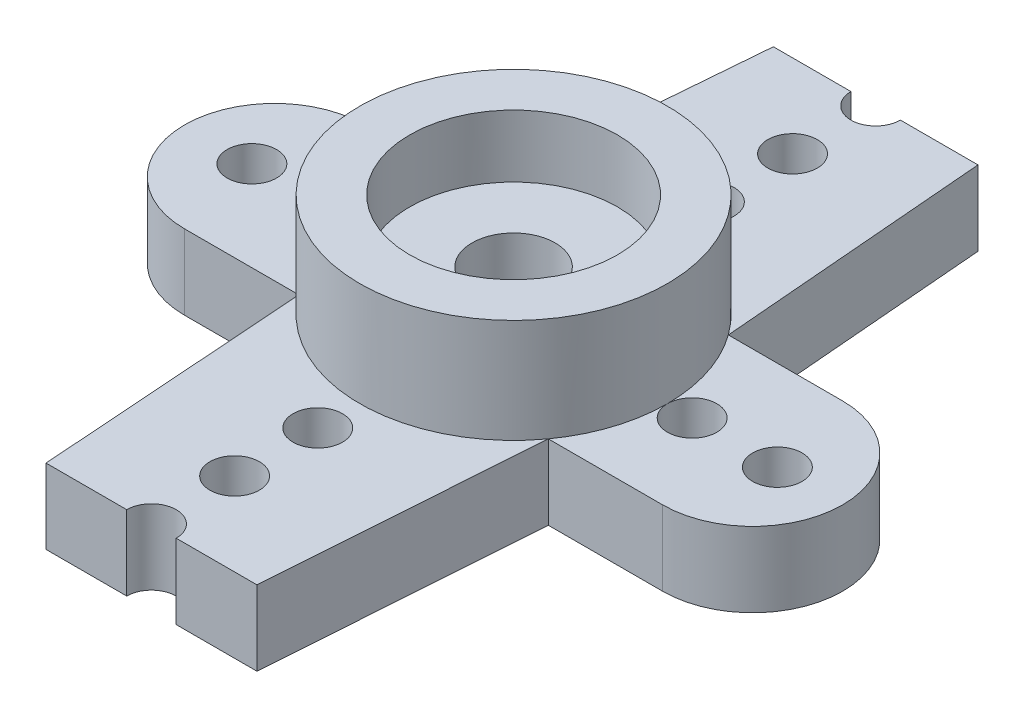
ISO-10303-21;
HEADER;
FILE_DESCRIPTION(('STEP AP214'),'2;1');
FILE_NAME('part.step','',(''),(''),'','','');
FILE_SCHEMA(('AUTOMOTIVE_DESIGN { 1 0 10303 214 1 1 1 1 }'));
ENDSEC;
DATA;
#1=APPLICATION_CONTEXT('core data for automotive mechanical design processes');
#2=APPLICATION_PROTOCOL_DEFINITION('international standard','automotive_design',2000,#1);
#3=PRODUCT_CONTEXT('',#1,'mechanical');
#4=PRODUCT('Part','Part','',(#3));
#5=PRODUCT_RELATED_PRODUCT_CATEGORY('part','',(#4));
#6=PRODUCT_DEFINITION_FORMATION('','',#4);
#7=PRODUCT_DEFINITION_CONTEXT('part definition',#1,'design');
#8=PRODUCT_DEFINITION('design','',#6,#7);
#9=PRODUCT_DEFINITION_SHAPE('','',#8);
#10=(LENGTH_UNIT() NAMED_UNIT(*) SI_UNIT(.MILLI.,.METRE.));
#11=(NAMED_UNIT(*) PLANE_ANGLE_UNIT() SI_UNIT($,.RADIAN.));
#12=(NAMED_UNIT(*) SI_UNIT($,.STERADIAN.) SOLID_ANGLE_UNIT());
#13=UNCERTAINTY_MEASURE_WITH_UNIT(LENGTH_MEASURE(1.E-05),#10,'distance_accuracy_value','');
#14=(GEOMETRIC_REPRESENTATION_CONTEXT(3) GLOBAL_UNCERTAINTY_ASSIGNED_CONTEXT((#13)) GLOBAL_UNIT_ASSIGNED_CONTEXT((#10,
#11,#12)) REPRESENTATION_CONTEXT('',''));
#15=CARTESIAN_POINT('',(0.,0.,0.));
#16=DIRECTION('',(0.,0.,1.));
#17=DIRECTION('',(1.,0.,0.));
#18=AXIS2_PLACEMENT_3D('',#15,#16,#17);
#19=CARTESIAN_POINT('',(0.,1.8,0.));
#20=DIRECTION('',(0.,-1.,0.));
#21=DIRECTION('',(0.,0.,-1.));
#22=AXIS2_PLACEMENT_3D('',#19,#20,#21);
#23=CYLINDRICAL_SURFACE('',#22,2.5);
#24=CARTESIAN_POINT('',(0.,4.3,0.));
#25=DIRECTION('',(0.,1.,0.));
#26=DIRECTION('',(0.,0.,1.));
#27=AXIS2_PLACEMENT_3D('',#24,#25,#26);
#28=CIRCLE('',#27,2.5);
#29=CARTESIAN_POINT('',(0.,4.3,2.5));
#30=VERTEX_POINT('',#29);
#31=EDGE_CURVE('E193',#30,#30,#28,.T.);
#32=ORIENTED_EDGE('',*,*,#31,.T.);
#33=EDGE_LOOP('',(#32));
#34=FACE_BOUND('',#33,.T.);
#35=CARTESIAN_POINT('',(0.,2.8,0.));
#36=DIRECTION('',(0.,-1.,0.));
#37=DIRECTION('',(0.,0.,-1.));
#38=AXIS2_PLACEMENT_3D('',#35,#36,#37);
#39=CIRCLE('',#38,2.5);
#40=CARTESIAN_POINT('',(0.,2.8,-2.5));
#41=VERTEX_POINT('',#40);
#42=EDGE_CURVE('E777',#41,#41,#39,.T.);
#43=ORIENTED_EDGE('',*,*,#42,.T.);
#44=EDGE_LOOP('',(#43));
#45=FACE_BOUND('',#44,.T.);
#46=ADVANCED_FACE('F33',(#34,#45),#23,.F.);
#47=CARTESIAN_POINT('',(0.,1.8,-8.71));
#48=DIRECTION('',(0.,1.,0.));
#49=DIRECTION('',(0.,0.,1.));
#50=AXIS2_PLACEMENT_3D('',#47,#48,#49);
#51=PLANE('',#50);
#52=CARTESIAN_POINT('',(0.,1.8,0.));
#53=DIRECTION('',(0.,1.,0.));
#54=DIRECTION('',(0.,0.,1.));
#55=AXIS2_PLACEMENT_3D('',#52,#53,#54);
#56=CIRCLE('',#55,3.7);
#57=CARTESIAN_POINT('',(3.00046246435445,1.8,2.16500000000001));
#58=VERTEX_POINT('',#57);
#59=CARTESIAN_POINT('',(3.7,1.8,0.));
#60=VERTEX_POINT('',#59);
#61=EDGE_CURVE('E187',#58,#60,#56,.T.);
#62=ORIENTED_EDGE('',*,*,#61,.F.);
#63=DIRECTION('',(1.,0.,0.));
#64=VECTOR('',#63,1.);
#65=CARTESIAN_POINT('',(5.75046246435445,1.8,2.16500000000001));
#66=LINE('',#65,#64);
#67=CARTESIAN_POINT('',(5.75046246435445,1.8,2.16500000000001));
#68=VERTEX_POINT('',#67);
#69=EDGE_CURVE('E155',#58,#68,#66,.T.);
#70=ORIENTED_EDGE('',*,*,#69,.T.);
#71=CARTESIAN_POINT('',(5.75046246435445,1.8,0.));
#72=DIRECTION('',(0.,1.,0.));
#73=DIRECTION('',(0.,0.,-1.));
#74=AXIS2_PLACEMENT_3D('',#71,#72,#73);
#75=CIRCLE('',#74,2.165);
#76=CARTESIAN_POINT('',(5.75046246435445,1.8,-2.16499999999999));
#77=VERTEX_POINT('',#76);
#78=EDGE_CURVE('E165',#68,#77,#75,.T.);
#79=ORIENTED_EDGE('',*,*,#78,.T.);
#80=DIRECTION('',(-1.,0.,0.));
#81=VECTOR('',#80,1.);
#82=CARTESIAN_POINT('',(5.75046246435445,1.8,-2.16499999999999));
#83=LINE('',#82,#81);
#84=CARTESIAN_POINT('',(3.00046246435445,1.8,-2.16499999999999));
#85=VERTEX_POINT('',#84);
#86=EDGE_CURVE('E276',#77,#85,#83,.T.);
#87=ORIENTED_EDGE('',*,*,#86,.T.);
#88=EDGE_CURVE('E41',#60,#85,#56,.T.);
#89=ORIENTED_EDGE('',*,*,#88,.F.);
#90=CARTESIAN_POINT('',(4.295,1.8,0.));
#91=DIRECTION('',(0.,1.,0.));
#92=DIRECTION('',(0.,0.,-1.));
#93=AXIS2_PLACEMENT_3D('',#90,#91,#92);
#94=CIRCLE('',#93,0.595);
#95=EDGE_CURVE('E190',#60,#60,#94,.T.);
#96=ORIENTED_EDGE('',*,*,#95,.F.);
#97=EDGE_LOOP('',(#62,#70,#79,#87,#89,#96));
#98=FACE_BOUND('',#97,.T.);
#99=CARTESIAN_POINT('',(6.345,1.8,0.));
#100=DIRECTION('',(0.,1.,0.));
#101=DIRECTION('',(0.,0.,-1.));
#102=AXIS2_PLACEMENT_3D('',#99,#100,#101);
#103=CIRCLE('',#102,0.595);
#104=CARTESIAN_POINT('',(6.345,1.8,-0.594999999999979));
#105=VERTEX_POINT('',#104);
#106=EDGE_CURVE('E209',#105,#105,#103,.T.);
#107=ORIENTED_EDGE('',*,*,#106,.F.);
#108=EDGE_LOOP('',(#107));
#109=FACE_BOUND('',#108,.T.);
#110=ADVANCED_FACE('F188',(#98,#109),#51,.T.);
#111=CARTESIAN_POINT('',(-3.00046246435445,1.8,-2.165));
#112=VERTEX_POINT('',#111);
#113=EDGE_CURVE('E375',#85,#112,#56,.T.);
#114=ORIENTED_EDGE('',*,*,#113,.F.);
#115=DIRECTION('',(-0.08216560287134,0.,-0.996618690224496));
#116=VECTOR('',#115,1.);
#117=CARTESIAN_POINT('',(3.00046246435445,1.8,-2.16499999999999));
#118=LINE('',#117,#116);
#119=CARTESIAN_POINT('',(2.46086404414844,1.8,-8.71));
#120=VERTEX_POINT('',#119);
#121=EDGE_CURVE('E278',#85,#120,#118,.T.);
#122=ORIENTED_EDGE('',*,*,#121,.T.);
#123=DIRECTION('',(-1.,0.,0.));
#124=VECTOR('',#123,1.);
#125=CARTESIAN_POINT('',(0.59499999999999,1.8,-8.71));
#126=LINE('',#125,#124);
#127=CARTESIAN_POINT('',(0.59499999999999,1.8,-8.71));
#128=VERTEX_POINT('',#127);
#129=EDGE_CURVE('E280',#120,#128,#126,.T.);
#130=ORIENTED_EDGE('',*,*,#129,.T.);
#131=CARTESIAN_POINT('',(0.,1.8,-8.71));
#132=DIRECTION('',(0.,-1.,0.));
#133=DIRECTION('',(0.,0.,1.));
#134=AXIS2_PLACEMENT_3D('',#131,#132,#133);
#135=CIRCLE('',#134,0.595);
#136=CARTESIAN_POINT('',(-0.59500000000001,1.8,-8.71));
#137=VERTEX_POINT('',#136);
#138=EDGE_CURVE('E253',#128,#137,#135,.T.);
#139=ORIENTED_EDGE('',*,*,#138,.T.);
#140=DIRECTION('',(-1.,0.,0.));
#141=VECTOR('',#140,1.);
#142=CARTESIAN_POINT('',(-2.46086404414844,1.8,-8.71));
#143=LINE('',#142,#141);
#144=CARTESIAN_POINT('',(-2.46086404414844,1.8,-8.71));
#145=VERTEX_POINT('',#144);
#146=EDGE_CURVE('E256',#137,#145,#143,.T.);
#147=ORIENTED_EDGE('',*,*,#146,.T.);
#148=DIRECTION('',(-0.08216560287134,0.,0.996618690224496));
#149=VECTOR('',#148,1.);
#150=CARTESIAN_POINT('',(-3.00046246435445,1.8,-2.165));
#151=LINE('',#150,#149);
#152=EDGE_CURVE('E259',#145,#112,#151,.T.);
#153=ORIENTED_EDGE('',*,*,#152,.T.);
#154=EDGE_LOOP('',(#114,#122,#130,#139,#147,#153));
#155=FACE_BOUND('',#154,.T.);
#156=CARTESIAN_POINT('',(0.,1.8,-4.71));
#157=DIRECTION('',(0.,1.,0.));
#158=DIRECTION('',(0.,0.,1.));
#159=AXIS2_PLACEMENT_3D('',#156,#157,#158);
#160=CIRCLE('',#159,0.595);
#161=CARTESIAN_POINT('',(0.,1.8,-4.115));
#162=VERTEX_POINT('',#161);
#163=EDGE_CURVE('E233',#162,#162,#160,.T.);
#164=ORIENTED_EDGE('',*,*,#163,.F.);
#165=EDGE_LOOP('',(#164));
#166=FACE_BOUND('',#165,.T.);
#167=CARTESIAN_POINT('',(0.,1.8,-6.71));
#168=DIRECTION('',(0.,1.,0.));
#169=DIRECTION('',(0.,0.,1.));
#170=AXIS2_PLACEMENT_3D('',#167,#168,#169);
#171=CIRCLE('',#170,0.595);
#172=CARTESIAN_POINT('',(0.,1.8,-6.115));
#173=VERTEX_POINT('',#172);
#174=EDGE_CURVE('E227',#173,#173,#171,.T.);
#175=ORIENTED_EDGE('',*,*,#174,.F.);
#176=EDGE_LOOP('',(#175));
#177=FACE_BOUND('',#176,.T.);
#178=ADVANCED_FACE('F377',(#155,#166,#177),#51,.T.);
#179=CARTESIAN_POINT('',(-3.7,1.8,0.));
#180=VERTEX_POINT('',#179);
#181=EDGE_CURVE('E198',#112,#180,#56,.T.);
#182=ORIENTED_EDGE('',*,*,#181,.F.);
#183=DIRECTION('',(-1.,0.,0.));
#184=VECTOR('',#183,1.);
#185=CARTESIAN_POINT('',(-5.75046246435445,1.8,-2.165));
#186=LINE('',#185,#184);
#187=CARTESIAN_POINT('',(-5.75046246435445,1.8,-2.165));
#188=VERTEX_POINT('',#187);
#189=EDGE_CURVE('E262',#112,#188,#186,.T.);
#190=ORIENTED_EDGE('',*,*,#189,.T.);
#191=CARTESIAN_POINT('',(-5.75046246435445,1.8,0.));
#192=DIRECTION('',(0.,1.,0.));
#193=DIRECTION('',(0.,0.,1.));
#194=AXIS2_PLACEMENT_3D('',#191,#192,#193);
#195=CIRCLE('',#194,2.165);
#196=CARTESIAN_POINT('',(-5.75046246435445,1.8,2.165));
#197=VERTEX_POINT('',#196);
#198=EDGE_CURVE('E264',#188,#197,#195,.T.);
#199=ORIENTED_EDGE('',*,*,#198,.T.);
#200=DIRECTION('',(1.,0.,0.));
#201=VECTOR('',#200,1.);
#202=CARTESIAN_POINT('',(-5.75046246435445,1.8,2.165));
#203=LINE('',#202,#201);
#204=CARTESIAN_POINT('',(-3.00046246435445,1.8,2.165));
#205=VERTEX_POINT('',#204);
#206=EDGE_CURVE('E266',#197,#205,#203,.T.);
#207=ORIENTED_EDGE('',*,*,#206,.T.);
#208=EDGE_CURVE('E55',#180,#205,#56,.T.);
#209=ORIENTED_EDGE('',*,*,#208,.F.);
#210=CARTESIAN_POINT('',(-4.295,1.8,0.));
#211=DIRECTION('',(0.,1.,0.));
#212=DIRECTION('',(0.,0.,1.));
#213=AXIS2_PLACEMENT_3D('',#210,#211,#212);
#214=CIRCLE('',#213,0.595);
#215=EDGE_CURVE('E245',#180,#180,#214,.T.);
#216=ORIENTED_EDGE('',*,*,#215,.F.);
#217=EDGE_LOOP('',(#182,#190,#199,#207,#209,#216));
#218=FACE_BOUND('',#217,.T.);
#219=CARTESIAN_POINT('',(-6.295,1.8,0.));
#220=DIRECTION('',(0.,1.,0.));
#221=DIRECTION('',(0.,0.,1.));
#222=AXIS2_PLACEMENT_3D('',#219,#220,#221);
#223=CIRCLE('',#222,0.595);
#224=CARTESIAN_POINT('',(-6.295,1.8,0.595000000000014));
#225=VERTEX_POINT('',#224);
#226=EDGE_CURVE('E239',#225,#225,#223,.T.);
#227=ORIENTED_EDGE('',*,*,#226,.F.);
#228=EDGE_LOOP('',(#227));
#229=FACE_BOUND('',#228,.T.);
#230=ADVANCED_FACE('F371',(#218,#229),#51,.T.);
#231=EDGE_CURVE('E181',#205,#58,#56,.T.);
#232=ORIENTED_EDGE('',*,*,#231,.F.);
#233=DIRECTION('',(0.0706024649861325,0.,0.997504532289394));
#234=VECTOR('',#233,1.);
#235=CARTESIAN_POINT('',(-3.00046246435445,1.8,2.165));
#236=LINE('',#235,#234);
#237=CARTESIAN_POINT('',(-2.53721330770784,1.8,8.71));
#238=VERTEX_POINT('',#237);
#239=EDGE_CURVE('E268',#205,#238,#236,.T.);
#240=ORIENTED_EDGE('',*,*,#239,.T.);
#241=DIRECTION('',(1.,0.,0.));
#242=VECTOR('',#241,1.);
#243=CARTESIAN_POINT('',(-0.594999999999954,1.8,8.71));
#244=LINE('',#243,#242);
#245=CARTESIAN_POINT('',(-0.594999999999954,1.8,8.71));
#246=VERTEX_POINT('',#245);
#247=EDGE_CURVE('E270',#238,#246,#244,.T.);
#248=ORIENTED_EDGE('',*,*,#247,.T.);
#249=CARTESIAN_POINT('',(0.,1.8,8.71));
#250=DIRECTION('',(0.,-1.,0.));
#251=DIRECTION('',(0.,0.,-1.));
#252=AXIS2_PLACEMENT_3D('',#249,#250,#251);
#253=CIRCLE('',#252,0.595);
#254=CARTESIAN_POINT('',(0.595000000000046,1.8,8.71));
#255=VERTEX_POINT('',#254);
#256=EDGE_CURVE('E272',#246,#255,#253,.T.);
#257=ORIENTED_EDGE('',*,*,#256,.T.);
#258=DIRECTION('',(1.,0.,0.));
#259=VECTOR('',#258,1.);
#260=CARTESIAN_POINT('',(0.595000000000046,1.8,8.71));
#261=LINE('',#260,#259);
#262=CARTESIAN_POINT('',(2.53721330770793,1.8,8.70999999999998));
#263=VERTEX_POINT('',#262);
#264=EDGE_CURVE('E183',#255,#263,#261,.T.);
#265=ORIENTED_EDGE('',*,*,#264,.T.);
#266=DIRECTION('',(0.0706024649861188,0.,-0.997504532289395));
#267=VECTOR('',#266,1.);
#268=CARTESIAN_POINT('',(3.00046246435445,1.8,2.16500000000001));
#269=LINE('',#268,#267);
#270=EDGE_CURVE('E166',#263,#58,#269,.T.);
#271=ORIENTED_EDGE('',*,*,#270,.T.);
#272=EDGE_LOOP('',(#232,#240,#248,#257,#265,#271));
#273=FACE_BOUND('',#272,.T.);
#274=CARTESIAN_POINT('',(0.,1.8,4.71));
#275=DIRECTION('',(0.,1.,0.));
#276=DIRECTION('',(0.,0.,-1.));
#277=AXIS2_PLACEMENT_3D('',#274,#275,#276);
#278=CIRCLE('',#277,0.595);
#279=CARTESIAN_POINT('',(0.,1.8,4.115));
#280=VERTEX_POINT('',#279);
#281=EDGE_CURVE('E221',#280,#280,#278,.T.);
#282=ORIENTED_EDGE('',*,*,#281,.F.);
#283=EDGE_LOOP('',(#282));
#284=FACE_BOUND('',#283,.T.);
#285=CARTESIAN_POINT('',(0.,1.8,6.71));
#286=DIRECTION('',(0.,1.,0.));
#287=DIRECTION('',(0.,0.,-1.));
#288=AXIS2_PLACEMENT_3D('',#285,#286,#287);
#289=CIRCLE('',#288,0.595);
#290=CARTESIAN_POINT('',(0.,1.8,6.115));
#291=VERTEX_POINT('',#290);
#292=EDGE_CURVE('E215',#291,#291,#289,.T.);
#293=ORIENTED_EDGE('',*,*,#292,.F.);
#294=EDGE_LOOP('',(#293));
#295=FACE_BOUND('',#294,.T.);
#296=ADVANCED_FACE('F178',(#273,#284,#295),#51,.T.);
#297=CARTESIAN_POINT('',(0.,0.,-8.71));
#298=DIRECTION('',(0.,1.,0.));
#299=DIRECTION('',(0.,0.,1.));
#300=AXIS2_PLACEMENT_3D('',#297,#298,#299);
#301=PLANE('',#300);
#302=CARTESIAN_POINT('',(6.345,0.,0.));
#303=DIRECTION('',(0.,1.,0.));
#304=DIRECTION('',(0.,0.,-1.));
#305=AXIS2_PLACEMENT_3D('',#302,#303,#304);
#306=CIRCLE('',#305,0.595);
#307=CARTESIAN_POINT('',(6.345,0.,-0.594999999999979));
#308=VERTEX_POINT('',#307);
#309=EDGE_CURVE('E205',#308,#308,#306,.T.);
#310=ORIENTED_EDGE('',*,*,#309,.T.);
#311=EDGE_LOOP('',(#310));
#312=FACE_BOUND('',#311,.T.);
#313=CARTESIAN_POINT('',(0.,0.,4.71));
#314=DIRECTION('',(0.,1.,0.));
#315=DIRECTION('',(0.,0.,-1.));
#316=AXIS2_PLACEMENT_3D('',#313,#314,#315);
#317=CIRCLE('',#316,0.595);
#318=CARTESIAN_POINT('',(0.,0.,4.115));
#319=VERTEX_POINT('',#318);
#320=EDGE_CURVE('E218',#319,#319,#317,.T.);
#321=ORIENTED_EDGE('',*,*,#320,.T.);
#322=EDGE_LOOP('',(#321));
#323=FACE_BOUND('',#322,.T.);
#324=CARTESIAN_POINT('',(0.,0.,-4.71));
#325=DIRECTION('',(0.,1.,0.));
#326=DIRECTION('',(0.,0.,1.));
#327=AXIS2_PLACEMENT_3D('',#324,#325,#326);
#328=CIRCLE('',#327,0.595);
#329=CARTESIAN_POINT('',(0.,0.,-4.115));
#330=VERTEX_POINT('',#329);
#331=EDGE_CURVE('E230',#330,#330,#328,.T.);
#332=ORIENTED_EDGE('',*,*,#331,.T.);
#333=EDGE_LOOP('',(#332));
#334=FACE_BOUND('',#333,.T.);
#335=CARTESIAN_POINT('',(-4.295,0.,0.));
#336=DIRECTION('',(0.,1.,0.));
#337=DIRECTION('',(0.,0.,1.));
#338=AXIS2_PLACEMENT_3D('',#335,#336,#337);
#339=CIRCLE('',#338,0.595);
#340=CARTESIAN_POINT('',(-4.295,0.,0.595));
#341=VERTEX_POINT('',#340);
#342=EDGE_CURVE('E242',#341,#341,#339,.T.);
#343=ORIENTED_EDGE('',*,*,#342,.T.);
#344=EDGE_LOOP('',(#343));
#345=FACE_BOUND('',#344,.T.);
#346=CARTESIAN_POINT('',(0.,0.,-8.71));
#347=DIRECTION('',(0.,-1.,0.));
#348=DIRECTION('',(0.,0.,1.));
#349=AXIS2_PLACEMENT_3D('',#346,#347,#348);
#350=CIRCLE('',#349,0.595);
#351=CARTESIAN_POINT('',(0.59499999999999,0.,-8.71));
#352=VERTEX_POINT('',#351);
#353=CARTESIAN_POINT('',(-0.59500000000001,0.,-8.71));
#354=VERTEX_POINT('',#353);
#355=EDGE_CURVE('E252',#352,#354,#350,.T.);
#356=ORIENTED_EDGE('',*,*,#355,.F.);
#357=DIRECTION('',(-1.,0.,0.));
#358=VECTOR('',#357,1.);
#359=CARTESIAN_POINT('',(0.59499999999999,0.,-8.71));
#360=LINE('',#359,#358);
#361=CARTESIAN_POINT('',(2.46086404414844,0.,-8.71));
#362=VERTEX_POINT('',#361);
#363=EDGE_CURVE('E257',#362,#352,#360,.T.);
#364=ORIENTED_EDGE('',*,*,#363,.F.);
#365=DIRECTION('',(-0.08216560287134,0.,-0.996618690224496));
#366=VECTOR('',#365,1.);
#367=CARTESIAN_POINT('',(3.00046246435445,0.,-2.16499999999999));
#368=LINE('',#367,#366);
#369=CARTESIAN_POINT('',(3.00046246435445,0.,-2.16499999999999));
#370=VERTEX_POINT('',#369);
#371=EDGE_CURVE('E311',#370,#362,#368,.T.);
#372=ORIENTED_EDGE('',*,*,#371,.F.);
#373=DIRECTION('',(-1.,0.,0.));
#374=VECTOR('',#373,1.);
#375=CARTESIAN_POINT('',(5.75046246435445,0.,-2.16499999999999));
#376=LINE('',#375,#374);
#377=CARTESIAN_POINT('',(5.75046246435445,0.,-2.16499999999999));
#378=VERTEX_POINT('',#377);
#379=EDGE_CURVE('E309',#378,#370,#376,.T.);
#380=ORIENTED_EDGE('',*,*,#379,.F.);
#381=CARTESIAN_POINT('',(5.75046246435445,0.,0.));
#382=DIRECTION('',(0.,1.,0.));
#383=DIRECTION('',(0.,0.,-1.));
#384=AXIS2_PLACEMENT_3D('',#381,#382,#383);
#385=CIRCLE('',#384,2.165);
#386=CARTESIAN_POINT('',(5.75046246435445,0.,2.16500000000001));
#387=VERTEX_POINT('',#386);
#388=EDGE_CURVE('E307',#387,#378,#385,.T.);
#389=ORIENTED_EDGE('',*,*,#388,.F.);
#390=DIRECTION('',(1.,0.,0.));
#391=VECTOR('',#390,1.);
#392=CARTESIAN_POINT('',(5.75046246435445,0.,2.16500000000001));
#393=LINE('',#392,#391);
#394=CARTESIAN_POINT('',(3.00046246435445,0.,2.16500000000001));
#395=VERTEX_POINT('',#394);
#396=EDGE_CURVE('E305',#395,#387,#393,.T.);
#397=ORIENTED_EDGE('',*,*,#396,.F.);
#398=DIRECTION('',(0.0706024649861188,0.,-0.997504532289395));
#399=VECTOR('',#398,1.);
#400=CARTESIAN_POINT('',(3.00046246435445,0.,2.16500000000001));
#401=LINE('',#400,#399);
#402=CARTESIAN_POINT('',(2.53721330770793,0.,8.70999999999998));
#403=VERTEX_POINT('',#402);
#404=EDGE_CURVE('E174',#403,#395,#401,.T.);
#405=ORIENTED_EDGE('',*,*,#404,.F.);
#406=DIRECTION('',(1.,0.,0.));
#407=VECTOR('',#406,1.);
#408=CARTESIAN_POINT('',(0.595000000000046,0.,8.71));
#409=LINE('',#408,#407);
#410=CARTESIAN_POINT('',(0.595000000000046,0.,8.71));
#411=VERTEX_POINT('',#410);
#412=EDGE_CURVE('E302',#411,#403,#409,.T.);
#413=ORIENTED_EDGE('',*,*,#412,.F.);
#414=CARTESIAN_POINT('',(0.,0.,8.71));
#415=DIRECTION('',(0.,-1.,0.));
#416=DIRECTION('',(0.,0.,-1.));
#417=AXIS2_PLACEMENT_3D('',#414,#415,#416);
#418=CIRCLE('',#417,0.595);
#419=CARTESIAN_POINT('',(-0.594999999999954,0.,8.71));
#420=VERTEX_POINT('',#419);
#421=EDGE_CURVE('E300',#420,#411,#418,.T.);
#422=ORIENTED_EDGE('',*,*,#421,.F.);
#423=DIRECTION('',(1.,0.,0.));
#424=VECTOR('',#423,1.);
#425=CARTESIAN_POINT('',(-0.594999999999954,0.,8.71));
#426=LINE('',#425,#424);
#427=CARTESIAN_POINT('',(-2.53721330770784,0.,8.71));
#428=VERTEX_POINT('',#427);
#429=EDGE_CURVE('E298',#428,#420,#426,.T.);
#430=ORIENTED_EDGE('',*,*,#429,.F.);
#431=DIRECTION('',(0.0706024649861325,0.,0.997504532289394));
#432=VECTOR('',#431,1.);
#433=CARTESIAN_POINT('',(-3.00046246435445,0.,2.165));
#434=LINE('',#433,#432);
#435=CARTESIAN_POINT('',(-3.00046246435445,0.,2.165));
#436=VERTEX_POINT('',#435);
#437=EDGE_CURVE('E296',#436,#428,#434,.T.);
#438=ORIENTED_EDGE('',*,*,#437,.F.);
#439=DIRECTION('',(1.,0.,0.));
#440=VECTOR('',#439,1.);
#441=CARTESIAN_POINT('',(-5.75046246435445,0.,2.165));
#442=LINE('',#441,#440);
#443=CARTESIAN_POINT('',(-5.75046246435445,0.,2.165));
#444=VERTEX_POINT('',#443);
#445=EDGE_CURVE('E294',#444,#436,#442,.T.);
#446=ORIENTED_EDGE('',*,*,#445,.F.);
#447=CARTESIAN_POINT('',(-5.75046246435445,0.,0.));
#448=DIRECTION('',(0.,1.,0.));
#449=DIRECTION('',(0.,0.,1.));
#450=AXIS2_PLACEMENT_3D('',#447,#448,#449);
#451=CIRCLE('',#450,2.165);
#452=CARTESIAN_POINT('',(-5.75046246435445,0.,-2.165));
#453=VERTEX_POINT('',#452);
#454=EDGE_CURVE('E292',#453,#444,#451,.T.);
#455=ORIENTED_EDGE('',*,*,#454,.F.);
#456=DIRECTION('',(-1.,0.,0.));
#457=VECTOR('',#456,1.);
#458=CARTESIAN_POINT('',(-5.75046246435445,0.,-2.165));
#459=LINE('',#458,#457);
#460=CARTESIAN_POINT('',(-3.00046246435445,0.,-2.165));
#461=VERTEX_POINT('',#460);
#462=EDGE_CURVE('E289',#461,#453,#459,.T.);
#463=ORIENTED_EDGE('',*,*,#462,.F.);
#464=DIRECTION('',(-0.08216560287134,0.,0.996618690224496));
#465=VECTOR('',#464,1.);
#466=CARTESIAN_POINT('',(-3.00046246435445,0.,-2.165));
#467=LINE('',#466,#465);
#468=CARTESIAN_POINT('',(-2.46086404414844,0.,-8.71));
#469=VERTEX_POINT('',#468);
#470=EDGE_CURVE('E287',#469,#461,#467,.T.);
#471=ORIENTED_EDGE('',*,*,#470,.F.);
#472=DIRECTION('',(-1.,0.,0.));
#473=VECTOR('',#472,1.);
#474=CARTESIAN_POINT('',(-2.46086404414844,0.,-8.71));
#475=LINE('',#474,#473);
#476=EDGE_CURVE('E285',#354,#469,#475,.T.);
#477=ORIENTED_EDGE('',*,*,#476,.F.);
#478=EDGE_LOOP('',(#356,#364,#372,#380,#389,#397,#405,#413,#422,#430,#438,#446,#455,#463,#471,#477));
#479=FACE_BOUND('',#478,.T.);
#480=CARTESIAN_POINT('',(0.,0.,0.));
#481=DIRECTION('',(0.,1.,0.));
#482=DIRECTION('',(0.,0.,1.));
#483=AXIS2_PLACEMENT_3D('',#480,#481,#482);
#484=CIRCLE('',#483,2.5);
#485=CARTESIAN_POINT('',(0.,0.,2.5));
#486=VERTEX_POINT('',#485);
#487=EDGE_CURVE('E247',#486,#486,#484,.T.);
#488=ORIENTED_EDGE('',*,*,#487,.T.);
#489=EDGE_LOOP('',(#488));
#490=FACE_BOUND('',#489,.T.);
#491=CARTESIAN_POINT('',(-6.295,0.,0.));
#492=DIRECTION('',(0.,1.,0.));
#493=DIRECTION('',(0.,0.,1.));
#494=AXIS2_PLACEMENT_3D('',#491,#492,#493);
#495=CIRCLE('',#494,0.595);
#496=CARTESIAN_POINT('',(-6.295,0.,0.595000000000014));
#497=VERTEX_POINT('',#496);
#498=EDGE_CURVE('E236',#497,#497,#495,.T.);
#499=ORIENTED_EDGE('',*,*,#498,.T.);
#500=EDGE_LOOP('',(#499));
#501=FACE_BOUND('',#500,.T.);
#502=CARTESIAN_POINT('',(0.,0.,-6.71));
#503=DIRECTION('',(0.,1.,0.));
#504=DIRECTION('',(0.,0.,1.));
#505=AXIS2_PLACEMENT_3D('',#502,#503,#504);
#506=CIRCLE('',#505,0.595);
#507=CARTESIAN_POINT('',(0.,0.,-6.115));
#508=VERTEX_POINT('',#507);
#509=EDGE_CURVE('E224',#508,#508,#506,.T.);
#510=ORIENTED_EDGE('',*,*,#509,.T.);
#511=EDGE_LOOP('',(#510));
#512=FACE_BOUND('',#511,.T.);
#513=CARTESIAN_POINT('',(0.,0.,6.71));
#514=DIRECTION('',(0.,1.,0.));
#515=DIRECTION('',(0.,0.,-1.));
#516=AXIS2_PLACEMENT_3D('',#513,#514,#515);
#517=CIRCLE('',#516,0.595);
#518=CARTESIAN_POINT('',(0.,0.,6.115));
#519=VERTEX_POINT('',#518);
#520=EDGE_CURVE('E212',#519,#519,#517,.T.);
#521=ORIENTED_EDGE('',*,*,#520,.T.);
#522=EDGE_LOOP('',(#521));
#523=FACE_BOUND('',#522,.T.);
#524=CARTESIAN_POINT('',(4.295,0.,0.));
#525=DIRECTION('',(0.,1.,0.));
#526=DIRECTION('',(0.,0.,-1.));
#527=AXIS2_PLACEMENT_3D('',#524,#525,#526);
#528=CIRCLE('',#527,0.595);
#529=CARTESIAN_POINT('',(4.295,0.,-0.594999999999993));
#530=VERTEX_POINT('',#529);
#531=EDGE_CURVE('E206',#530,#530,#528,.T.);
#532=ORIENTED_EDGE('',*,*,#531,.T.);
#533=EDGE_LOOP('',(#532));
#534=FACE_BOUND('',#533,.T.);
#535=ADVANCED_FACE('F359',(#312,#323,#334,#345,#479,#490,#501,#512,#523,#534),#301,.F.);
#536=CARTESIAN_POINT('',(0.,1.8,-8.71));
#537=DIRECTION('',(0.,-1.,0.));
#538=DIRECTION('',(0.,0.,-1.));
#539=AXIS2_PLACEMENT_3D('',#536,#537,#538);
#540=CYLINDRICAL_SURFACE('',#539,0.595);
#541=ORIENTED_EDGE('',*,*,#355,.T.);
#542=DIRECTION('',(0.,-1.,0.));
#543=VECTOR('',#542,1.);
#544=CARTESIAN_POINT('',(-0.59500000000001,1.8,-8.71));
#545=LINE('',#544,#543);
#546=EDGE_CURVE('E197',#137,#354,#545,.T.);
#547=ORIENTED_EDGE('',*,*,#546,.F.);
#548=ORIENTED_EDGE('',*,*,#138,.F.);
#549=DIRECTION('',(0.,-1.,0.));
#550=VECTOR('',#549,1.);
#551=CARTESIAN_POINT('',(0.59499999999999,1.8,-8.71));
#552=LINE('',#551,#550);
#553=EDGE_CURVE('E282',#128,#352,#552,.T.);
#554=ORIENTED_EDGE('',*,*,#553,.T.);
#555=EDGE_LOOP('',(#541,#547,#548,#554));
#556=FACE_BOUND('',#555,.T.);
#557=ADVANCED_FACE('F35',(#556),#540,.F.);
#558=CARTESIAN_POINT('',(-2.46086404414844,1.8,-8.71));
#559=DIRECTION('',(0.,0.,1.));
#560=DIRECTION('',(1.,0.,0.));
#561=AXIS2_PLACEMENT_3D('',#558,#559,#560);
#562=PLANE('',#561);
#563=ORIENTED_EDGE('',*,*,#476,.T.);
#564=DIRECTION('',(0.,-1.,0.));
#565=VECTOR('',#564,1.);
#566=CARTESIAN_POINT('',(-2.46086404414844,1.8,-8.71));
#567=LINE('',#566,#565);
#568=EDGE_CURVE('E200',#145,#469,#567,.T.);
#569=ORIENTED_EDGE('',*,*,#568,.F.);
#570=ORIENTED_EDGE('',*,*,#146,.F.);
#571=ORIENTED_EDGE('',*,*,#546,.T.);
#572=EDGE_LOOP('',(#563,#569,#570,#571));
#573=FACE_BOUND('',#572,.T.);
#574=ADVANCED_FACE('F398',(#573),#562,.F.);
#575=CARTESIAN_POINT('',(-3.00046246435445,1.8,-2.165));
#576=DIRECTION('',(0.996618690224496,0.,0.08216560287134));
#577=DIRECTION('',(0.08216560287134,0.,-0.996618690224496));
#578=AXIS2_PLACEMENT_3D('',#575,#576,#577);
#579=PLANE('',#578);
#580=ORIENTED_EDGE('',*,*,#470,.T.);
#581=DIRECTION('',(0.,-1.,0.));
#582=VECTOR('',#581,1.);
#583=CARTESIAN_POINT('',(-3.00046246435445,1.8,-2.165));
#584=LINE('',#583,#582);
#585=EDGE_CURVE('E345',#112,#461,#584,.T.);
#586=ORIENTED_EDGE('',*,*,#585,.F.);
#587=ORIENTED_EDGE('',*,*,#152,.F.);
#588=ORIENTED_EDGE('',*,*,#568,.T.);
#589=EDGE_LOOP('',(#580,#586,#587,#588));
#590=FACE_BOUND('',#589,.T.);
#591=ADVANCED_FACE('F353',(#590),#579,.F.);
#592=CARTESIAN_POINT('',(-5.75046246435445,1.8,-2.165));
#593=DIRECTION('',(0.,0.,1.));
#594=DIRECTION('',(1.,0.,0.));
#595=AXIS2_PLACEMENT_3D('',#592,#593,#594);
#596=PLANE('',#595);
#597=ORIENTED_EDGE('',*,*,#462,.T.);
#598=DIRECTION('',(0.,-1.,0.));
#599=VECTOR('',#598,1.);
#600=CARTESIAN_POINT('',(-5.75046246435445,1.8,-2.165));
#601=LINE('',#600,#599);
#602=EDGE_CURVE('E342',#188,#453,#601,.T.);
#603=ORIENTED_EDGE('',*,*,#602,.F.);
#604=ORIENTED_EDGE('',*,*,#189,.F.);
#605=ORIENTED_EDGE('',*,*,#585,.T.);
#606=EDGE_LOOP('',(#597,#603,#604,#605));
#607=FACE_BOUND('',#606,.T.);
#608=ADVANCED_FACE('F364',(#607),#596,.F.);
#609=CARTESIAN_POINT('',(-5.75046246435445,1.8,0.));
#610=DIRECTION('',(0.,-1.,0.));
#611=DIRECTION('',(0.,0.,-1.));
#612=AXIS2_PLACEMENT_3D('',#609,#610,#611);
#613=CYLINDRICAL_SURFACE('',#612,2.165);
#614=ORIENTED_EDGE('',*,*,#454,.T.);
#615=DIRECTION('',(0.,-1.,0.));
#616=VECTOR('',#615,1.);
#617=CARTESIAN_POINT('',(-5.75046246435445,1.8,2.165));
#618=LINE('',#617,#616);
#619=EDGE_CURVE('E339',#197,#444,#618,.T.);
#620=ORIENTED_EDGE('',*,*,#619,.F.);
#621=ORIENTED_EDGE('',*,*,#198,.F.);
#622=ORIENTED_EDGE('',*,*,#602,.T.);
#623=EDGE_LOOP('',(#614,#620,#621,#622));
#624=FACE_BOUND('',#623,.T.);
#625=ADVANCED_FACE('F368',(#624),#613,.T.);
#626=CARTESIAN_POINT('',(-5.75046246435445,1.8,2.165));
#627=DIRECTION('',(0.,0.,-1.));
#628=DIRECTION('',(-1.,0.,0.));
#629=AXIS2_PLACEMENT_3D('',#626,#627,#628);
#630=PLANE('',#629);
#631=ORIENTED_EDGE('',*,*,#445,.T.);
#632=DIRECTION('',(0.,-1.,0.));
#633=VECTOR('',#632,1.);
#634=CARTESIAN_POINT('',(-3.00046246435445,1.8,2.165));
#635=LINE('',#634,#633);
#636=EDGE_CURVE('E336',#205,#436,#635,.T.);
#637=ORIENTED_EDGE('',*,*,#636,.F.);
#638=ORIENTED_EDGE('',*,*,#206,.F.);
#639=ORIENTED_EDGE('',*,*,#619,.T.);
#640=EDGE_LOOP('',(#631,#637,#638,#639));
#641=FACE_BOUND('',#640,.T.);
#642=ADVANCED_FACE('F512',(#641),#630,.F.);
#643=CARTESIAN_POINT('',(-3.00046246435445,1.8,2.165));
#644=DIRECTION('',(0.997504532289394,0.,-0.0706024649861325));
#645=DIRECTION('',(-0.0706024649861325,0.,-0.997504532289394));
#646=AXIS2_PLACEMENT_3D('',#643,#644,#645);
#647=PLANE('',#646);
#648=ORIENTED_EDGE('',*,*,#437,.T.);
#649=DIRECTION('',(0.,-1.,0.));
#650=VECTOR('',#649,1.);
#651=CARTESIAN_POINT('',(-2.53721330770784,1.8,8.71));
#652=LINE('',#651,#650);
#653=EDGE_CURVE('E333',#238,#428,#652,.T.);
#654=ORIENTED_EDGE('',*,*,#653,.F.);
#655=ORIENTED_EDGE('',*,*,#239,.F.);
#656=ORIENTED_EDGE('',*,*,#636,.T.);
#657=EDGE_LOOP('',(#648,#654,#655,#656));
#658=FACE_BOUND('',#657,.T.);
#659=ADVANCED_FACE('F508',(#658),#647,.F.);
#660=CARTESIAN_POINT('',(-0.594999999999954,1.8,8.71));
#661=DIRECTION('',(0.,0.,-1.));
#662=DIRECTION('',(-1.,0.,0.));
#663=AXIS2_PLACEMENT_3D('',#660,#661,#662);
#664=PLANE('',#663);
#665=ORIENTED_EDGE('',*,*,#429,.T.);
#666=DIRECTION('',(0.,-1.,0.));
#667=VECTOR('',#666,1.);
#668=CARTESIAN_POINT('',(-0.594999999999954,1.8,8.71));
#669=LINE('',#668,#667);
#670=EDGE_CURVE('E330',#246,#420,#669,.T.);
#671=ORIENTED_EDGE('',*,*,#670,.F.);
#672=ORIENTED_EDGE('',*,*,#247,.F.);
#673=ORIENTED_EDGE('',*,*,#653,.T.);
#674=EDGE_LOOP('',(#665,#671,#672,#673));
#675=FACE_BOUND('',#674,.T.);
#676=ADVANCED_FACE('F504',(#675),#664,.F.);
#677=CARTESIAN_POINT('',(0.,1.8,8.71));
#678=DIRECTION('',(0.,-1.,0.));
#679=DIRECTION('',(0.,0.,-1.));
#680=AXIS2_PLACEMENT_3D('',#677,#678,#679);
#681=CYLINDRICAL_SURFACE('',#680,0.595);
#682=ORIENTED_EDGE('',*,*,#421,.T.);
#683=DIRECTION('',(0.,-1.,0.));
#684=VECTOR('',#683,1.);
#685=CARTESIAN_POINT('',(0.595000000000046,1.8,8.71));
#686=LINE('',#685,#684);
#687=EDGE_CURVE('E327',#255,#411,#686,.T.);
#688=ORIENTED_EDGE('',*,*,#687,.F.);
#689=ORIENTED_EDGE('',*,*,#256,.F.);
#690=ORIENTED_EDGE('',*,*,#670,.T.);
#691=EDGE_LOOP('',(#682,#688,#689,#690));
#692=FACE_BOUND('',#691,.T.);
#693=ADVANCED_FACE('F500',(#692),#681,.F.);
#694=CARTESIAN_POINT('',(0.595000000000046,1.8,8.71));
#695=DIRECTION('',(0.,0.,-1.));
#696=DIRECTION('',(-1.,0.,0.));
#697=AXIS2_PLACEMENT_3D('',#694,#695,#696);
#698=PLANE('',#697);
#699=ORIENTED_EDGE('',*,*,#412,.T.);
#700=DIRECTION('',(0.,-1.,0.));
#701=VECTOR('',#700,1.);
#702=CARTESIAN_POINT('',(2.53721330770793,1.8,8.70999999999998));
#703=LINE('',#702,#701);
#704=EDGE_CURVE('E175',#263,#403,#703,.T.);
#705=ORIENTED_EDGE('',*,*,#704,.F.);
#706=ORIENTED_EDGE('',*,*,#264,.F.);
#707=ORIENTED_EDGE('',*,*,#687,.T.);
#708=EDGE_LOOP('',(#699,#705,#706,#707));
#709=FACE_BOUND('',#708,.T.);
#710=ADVANCED_FACE('F497',(#709),#698,.F.);
#711=CARTESIAN_POINT('',(3.00046246435445,1.8,2.16500000000001));
#712=DIRECTION('',(-0.997504532289395,0.,-0.0706024649861188));
#713=DIRECTION('',(-0.0706024649861188,0.,0.997504532289395));
#714=AXIS2_PLACEMENT_3D('',#711,#712,#713);
#715=PLANE('',#714);
#716=ORIENTED_EDGE('',*,*,#404,.T.);
#717=DIRECTION('',(0.,-1.,0.));
#718=VECTOR('',#717,1.);
#719=CARTESIAN_POINT('',(3.00046246435445,1.8,2.16500000000001));
#720=LINE('',#719,#718);
#721=EDGE_CURVE('E159',#58,#395,#720,.T.);
#722=ORIENTED_EDGE('',*,*,#721,.F.);
#723=ORIENTED_EDGE('',*,*,#270,.F.);
#724=ORIENTED_EDGE('',*,*,#704,.T.);
#725=EDGE_LOOP('',(#716,#722,#723,#724));
#726=FACE_BOUND('',#725,.T.);
#727=ADVANCED_FACE('F171',(#726),#715,.F.);
#728=CARTESIAN_POINT('',(5.75046246435445,1.8,2.16500000000001));
#729=DIRECTION('',(0.,0.,-1.));
#730=DIRECTION('',(-1.,0.,0.));
#731=AXIS2_PLACEMENT_3D('',#728,#729,#730);
#732=PLANE('',#731);
#733=ORIENTED_EDGE('',*,*,#396,.T.);
#734=DIRECTION('',(0.,-1.,0.));
#735=VECTOR('',#734,1.);
#736=CARTESIAN_POINT('',(5.75046246435445,1.8,2.16500000000001));
#737=LINE('',#736,#735);
#738=EDGE_CURVE('E162',#68,#387,#737,.T.);
#739=ORIENTED_EDGE('',*,*,#738,.F.);
#740=ORIENTED_EDGE('',*,*,#69,.F.);
#741=ORIENTED_EDGE('',*,*,#721,.T.);
#742=EDGE_LOOP('',(#733,#739,#740,#741));
#743=FACE_BOUND('',#742,.T.);
#744=ADVANCED_FACE('F158',(#743),#732,.F.);
#745=CARTESIAN_POINT('',(5.75046246435445,1.8,0.));
#746=DIRECTION('',(0.,-1.,0.));
#747=DIRECTION('',(0.,0.,-1.));
#748=AXIS2_PLACEMENT_3D('',#745,#746,#747);
#749=CYLINDRICAL_SURFACE('',#748,2.165);
#750=ORIENTED_EDGE('',*,*,#388,.T.);
#751=DIRECTION('',(0.,-1.,0.));
#752=VECTOR('',#751,1.);
#753=CARTESIAN_POINT('',(5.75046246435445,1.8,-2.16499999999999));
#754=LINE('',#753,#752);
#755=EDGE_CURVE('E322',#77,#378,#754,.T.);
#756=ORIENTED_EDGE('',*,*,#755,.F.);
#757=ORIENTED_EDGE('',*,*,#78,.F.);
#758=ORIENTED_EDGE('',*,*,#738,.T.);
#759=EDGE_LOOP('',(#750,#756,#757,#758));
#760=FACE_BOUND('',#759,.T.);
#761=ADVANCED_FACE('F489',(#760),#749,.T.);
#762=CARTESIAN_POINT('',(5.75046246435445,1.8,-2.16499999999999));
#763=DIRECTION('',(0.,0.,1.));
#764=DIRECTION('',(1.,0.,0.));
#765=AXIS2_PLACEMENT_3D('',#762,#763,#764);
#766=PLANE('',#765);
#767=ORIENTED_EDGE('',*,*,#379,.T.);
#768=DIRECTION('',(0.,-1.,0.));
#769=VECTOR('',#768,1.);
#770=CARTESIAN_POINT('',(3.00046246435445,1.8,-2.16499999999999));
#771=LINE('',#770,#769);
#772=EDGE_CURVE('E319',#85,#370,#771,.T.);
#773=ORIENTED_EDGE('',*,*,#772,.F.);
#774=ORIENTED_EDGE('',*,*,#86,.F.);
#775=ORIENTED_EDGE('',*,*,#755,.T.);
#776=EDGE_LOOP('',(#767,#773,#774,#775));
#777=FACE_BOUND('',#776,.T.);
#778=ADVANCED_FACE('F385',(#777),#766,.F.);
#779=CARTESIAN_POINT('',(3.00046246435445,1.8,-2.16499999999999));
#780=DIRECTION('',(-0.996618690224496,0.,0.08216560287134));
#781=DIRECTION('',(0.08216560287134,0.,0.996618690224496));
#782=AXIS2_PLACEMENT_3D('',#779,#780,#781);
#783=PLANE('',#782);
#784=ORIENTED_EDGE('',*,*,#371,.T.);
#785=DIRECTION('',(0.,-1.,0.));
#786=VECTOR('',#785,1.);
#787=CARTESIAN_POINT('',(2.46086404414844,1.8,-8.71));
#788=LINE('',#787,#786);
#789=EDGE_CURVE('E316',#120,#362,#788,.T.);
#790=ORIENTED_EDGE('',*,*,#789,.F.);
#791=ORIENTED_EDGE('',*,*,#121,.F.);
#792=ORIENTED_EDGE('',*,*,#772,.T.);
#793=EDGE_LOOP('',(#784,#790,#791,#792));
#794=FACE_BOUND('',#793,.T.);
#795=ADVANCED_FACE('F389',(#794),#783,.F.);
#796=CARTESIAN_POINT('',(0.59499999999999,1.8,-8.71));
#797=DIRECTION('',(0.,0.,1.));
#798=DIRECTION('',(1.,0.,0.));
#799=AXIS2_PLACEMENT_3D('',#796,#797,#798);
#800=PLANE('',#799);
#801=ORIENTED_EDGE('',*,*,#363,.T.);
#802=ORIENTED_EDGE('',*,*,#553,.F.);
#803=ORIENTED_EDGE('',*,*,#129,.F.);
#804=ORIENTED_EDGE('',*,*,#789,.T.);
#805=EDGE_LOOP('',(#801,#802,#803,#804));
#806=FACE_BOUND('',#805,.T.);
#807=ADVANCED_FACE('F394',(#806),#800,.F.);
#808=CARTESIAN_POINT('',(0.,1.,0.));
#809=DIRECTION('',(0.,-1.,0.));
#810=DIRECTION('',(0.,0.,-1.));
#811=AXIS2_PLACEMENT_3D('',#808,#809,#810);
#812=CIRCLE('',#811,2.5);
#813=CARTESIAN_POINT('',(0.,1.,-2.5));
#814=VERTEX_POINT('',#813);
#815=EDGE_CURVE('E11',#814,#814,#812,.T.);
#816=ORIENTED_EDGE('',*,*,#815,.F.);
#817=EDGE_LOOP('',(#816));
#818=FACE_BOUND('',#817,.T.);
#819=ORIENTED_EDGE('',*,*,#487,.F.);
#820=EDGE_LOOP('',(#819));
#821=FACE_BOUND('',#820,.T.);
#822=ADVANCED_FACE('F408',(#818,#821),#23,.F.);
#823=CARTESIAN_POINT('',(-4.295,1.8,0.));
#824=DIRECTION('',(0.,-1.,0.));
#825=DIRECTION('',(0.,0.,-1.));
#826=AXIS2_PLACEMENT_3D('',#823,#824,#825);
#827=CYLINDRICAL_SURFACE('',#826,0.595);
#828=ORIENTED_EDGE('',*,*,#215,.T.);
#829=EDGE_LOOP('',(#828));
#830=FACE_BOUND('',#829,.T.);
#831=ORIENTED_EDGE('',*,*,#342,.F.);
#832=EDGE_LOOP('',(#831));
#833=FACE_BOUND('',#832,.T.);
#834=ADVANCED_FACE('F417',(#830,#833),#827,.F.);
#835=CARTESIAN_POINT('',(-6.295,1.8,0.));
#836=DIRECTION('',(0.,-1.,0.));
#837=DIRECTION('',(0.,0.,-1.));
#838=AXIS2_PLACEMENT_3D('',#835,#836,#837);
#839=CYLINDRICAL_SURFACE('',#838,0.595);
#840=ORIENTED_EDGE('',*,*,#226,.T.);
#841=EDGE_LOOP('',(#840));
#842=FACE_BOUND('',#841,.T.);
#843=ORIENTED_EDGE('',*,*,#498,.F.);
#844=EDGE_LOOP('',(#843));
#845=FACE_BOUND('',#844,.T.);
#846=ADVANCED_FACE('F423',(#842,#845),#839,.F.);
#847=CARTESIAN_POINT('',(0.,1.8,-4.71));
#848=DIRECTION('',(0.,-1.,0.));
#849=DIRECTION('',(0.,0.,-1.));
#850=AXIS2_PLACEMENT_3D('',#847,#848,#849);
#851=CYLINDRICAL_SURFACE('',#850,0.595);
#852=ORIENTED_EDGE('',*,*,#163,.T.);
#853=EDGE_LOOP('',(#852));
#854=FACE_BOUND('',#853,.T.);
#855=ORIENTED_EDGE('',*,*,#331,.F.);
#856=EDGE_LOOP('',(#855));
#857=FACE_BOUND('',#856,.T.);
#858=ADVANCED_FACE('F468',(#854,#857),#851,.F.);
#859=CARTESIAN_POINT('',(0.,1.8,-6.71));
#860=DIRECTION('',(0.,-1.,0.));
#861=DIRECTION('',(0.,0.,-1.));
#862=AXIS2_PLACEMENT_3D('',#859,#860,#861);
#863=CYLINDRICAL_SURFACE('',#862,0.595);
#864=ORIENTED_EDGE('',*,*,#174,.T.);
#865=EDGE_LOOP('',(#864));
#866=FACE_BOUND('',#865,.T.);
#867=ORIENTED_EDGE('',*,*,#509,.F.);
#868=EDGE_LOOP('',(#867));
#869=FACE_BOUND('',#868,.T.);
#870=ADVANCED_FACE('F464',(#866,#869),#863,.F.);
#871=CARTESIAN_POINT('',(0.,1.8,4.71));
#872=DIRECTION('',(0.,-1.,0.));
#873=DIRECTION('',(0.,0.,-1.));
#874=AXIS2_PLACEMENT_3D('',#871,#872,#873);
#875=CYLINDRICAL_SURFACE('',#874,0.595);
#876=ORIENTED_EDGE('',*,*,#281,.T.);
#877=EDGE_LOOP('',(#876));
#878=FACE_BOUND('',#877,.T.);
#879=ORIENTED_EDGE('',*,*,#320,.F.);
#880=EDGE_LOOP('',(#879));
#881=FACE_BOUND('',#880,.T.);
#882=ADVANCED_FACE('F460',(#878,#881),#875,.F.);
#883=CARTESIAN_POINT('',(0.,1.8,6.71));
#884=DIRECTION('',(0.,-1.,0.));
#885=DIRECTION('',(0.,0.,-1.));
#886=AXIS2_PLACEMENT_3D('',#883,#884,#885);
#887=CYLINDRICAL_SURFACE('',#886,0.595);
#888=ORIENTED_EDGE('',*,*,#292,.T.);
#889=EDGE_LOOP('',(#888));
#890=FACE_BOUND('',#889,.T.);
#891=ORIENTED_EDGE('',*,*,#520,.F.);
#892=EDGE_LOOP('',(#891));
#893=FACE_BOUND('',#892,.T.);
#894=ADVANCED_FACE('F453',(#890,#893),#887,.F.);
#895=CARTESIAN_POINT('',(6.345,1.8,0.));
#896=DIRECTION('',(0.,-1.,0.));
#897=DIRECTION('',(0.,0.,-1.));
#898=AXIS2_PLACEMENT_3D('',#895,#896,#897);
#899=CYLINDRICAL_SURFACE('',#898,0.595);
#900=ORIENTED_EDGE('',*,*,#106,.T.);
#901=EDGE_LOOP('',(#900));
#902=FACE_BOUND('',#901,.T.);
#903=ORIENTED_EDGE('',*,*,#309,.F.);
#904=EDGE_LOOP('',(#903));
#905=FACE_BOUND('',#904,.T.);
#906=ADVANCED_FACE('F444',(#902,#905),#899,.F.);
#907=CARTESIAN_POINT('',(4.295,1.8,0.));
#908=DIRECTION('',(0.,-1.,0.));
#909=DIRECTION('',(0.,0.,-1.));
#910=AXIS2_PLACEMENT_3D('',#907,#908,#909);
#911=CYLINDRICAL_SURFACE('',#910,0.595);
#912=ORIENTED_EDGE('',*,*,#95,.T.);
#913=EDGE_LOOP('',(#912));
#914=FACE_BOUND('',#913,.T.);
#915=ORIENTED_EDGE('',*,*,#531,.F.);
#916=EDGE_LOOP('',(#915));
#917=FACE_BOUND('',#916,.T.);
#918=ADVANCED_FACE('F441',(#914,#917),#911,.F.);
#919=CARTESIAN_POINT('',(0.,4.3,0.));
#920=DIRECTION('',(0.,1.,0.));
#921=DIRECTION('',(0.,0.,1.));
#922=AXIS2_PLACEMENT_3D('',#919,#920,#921);
#923=PLANE('',#922);
#924=CARTESIAN_POINT('',(0.,4.3,0.));
#925=DIRECTION('',(0.,1.,0.));
#926=DIRECTION('',(0.,0.,1.));
#927=AXIS2_PLACEMENT_3D('',#924,#925,#926);
#928=CIRCLE('',#927,3.7);
#929=CARTESIAN_POINT('',(0.,4.3,3.7));
#930=VERTEX_POINT('',#929);
#931=EDGE_CURVE('E192',#930,#930,#928,.T.);
#932=ORIENTED_EDGE('',*,*,#931,.T.);
#933=EDGE_LOOP('',(#932));
#934=FACE_BOUND('',#933,.T.);
#935=ORIENTED_EDGE('',*,*,#31,.F.);
#936=EDGE_LOOP('',(#935));
#937=FACE_BOUND('',#936,.T.);
#938=ADVANCED_FACE('F443',(#934,#937),#923,.T.);
#939=CARTESIAN_POINT('',(0.,4.3,0.));
#940=DIRECTION('',(0.,-1.,0.));
#941=DIRECTION('',(0.,0.,-1.));
#942=AXIS2_PLACEMENT_3D('',#939,#940,#941);
#943=CYLINDRICAL_SURFACE('',#942,3.7);
#944=ORIENTED_EDGE('',*,*,#931,.F.);
#945=EDGE_LOOP('',(#944));
#946=FACE_BOUND('',#945,.T.);
#947=ORIENTED_EDGE('',*,*,#61,.T.);
#948=ORIENTED_EDGE('',*,*,#88,.T.);
#949=ORIENTED_EDGE('',*,*,#113,.T.);
#950=ORIENTED_EDGE('',*,*,#181,.T.);
#951=ORIENTED_EDGE('',*,*,#208,.T.);
#952=ORIENTED_EDGE('',*,*,#231,.T.);
#953=EDGE_LOOP('',(#947,#948,#949,#950,#951,#952));
#954=FACE_BOUND('',#953,.T.);
#955=ADVANCED_FACE('F195',(#946,#954),#943,.T.);
#956=CARTESIAN_POINT('',(0.,2.8,0.));
#957=DIRECTION('',(0.,-1.,0.));
#958=DIRECTION('',(0.,0.,-1.));
#959=AXIS2_PLACEMENT_3D('',#956,#957,#958);
#960=PLANE('',#959);
#961=CARTESIAN_POINT('',(0.,2.8,0.));
#962=DIRECTION('',(0.,-1.,0.));
#963=DIRECTION('',(0.,0.,-1.));
#964=AXIS2_PLACEMENT_3D('',#961,#962,#963);
#965=CIRCLE('',#964,1.);
#966=CARTESIAN_POINT('',(0.,2.8,-1.));
#967=VERTEX_POINT('',#966);
#968=EDGE_CURVE('E772',#967,#967,#965,.T.);
#969=ORIENTED_EDGE('',*,*,#968,.T.);
#970=EDGE_LOOP('',(#969));
#971=FACE_BOUND('',#970,.T.);
#972=ORIENTED_EDGE('',*,*,#42,.F.);
#973=EDGE_LOOP('',(#972));
#974=FACE_BOUND('',#973,.T.);
#975=ADVANCED_FACE('F727',(#971,#974),#960,.F.);
#976=CARTESIAN_POINT('',(0.,1.,0.));
#977=DIRECTION('',(0.,-1.,0.));
#978=DIRECTION('',(0.,0.,-1.));
#979=AXIS2_PLACEMENT_3D('',#976,#977,#978);
#980=PLANE('',#979);
#981=CARTESIAN_POINT('',(0.,1.,0.));
#982=DIRECTION('',(0.,-1.,0.));
#983=DIRECTION('',(0.,0.,-1.));
#984=AXIS2_PLACEMENT_3D('',#981,#982,#983);
#985=CIRCLE('',#984,1.);
#986=CARTESIAN_POINT('',(0.,1.,-1.));
#987=VERTEX_POINT('',#986);
#988=EDGE_CURVE('E775',#987,#987,#985,.T.);
#989=ORIENTED_EDGE('',*,*,#988,.F.);
#990=EDGE_LOOP('',(#989));
#991=FACE_BOUND('',#990,.T.);
#992=ORIENTED_EDGE('',*,*,#815,.T.);
#993=EDGE_LOOP('',(#992));
#994=FACE_BOUND('',#993,.T.);
#995=ADVANCED_FACE('F745',(#991,#994),#980,.T.);
#996=CARTESIAN_POINT('',(0.,2.8,0.));
#997=DIRECTION('',(0.,-1.,0.));
#998=DIRECTION('',(0.,0.,-1.));
#999=AXIS2_PLACEMENT_3D('',#996,#997,#998);
#1000=CYLINDRICAL_SURFACE('',#999,1.);
#1001=ORIENTED_EDGE('',*,*,#968,.F.);
#1002=EDGE_LOOP('',(#1001));
#1003=FACE_BOUND('',#1002,.T.);
#1004=ORIENTED_EDGE('',*,*,#988,.T.);
#1005=EDGE_LOOP('',(#1004));
#1006=FACE_BOUND('',#1005,.T.);
#1007=ADVANCED_FACE('F755',(#1003,#1006),#1000,.F.);
#1008=CLOSED_SHELL('',(#46,#110,#178,#230,#296,#535,#557,#574,#591,#608,#625,#642,#659,#676,
#693,#710,#727,#744,#761,#778,#795,#807,#822,#834,#846,#858,#870,#882,#894,#906,#918,#938,#955,
#975,#995,#1007));
#1009=MANIFOLD_SOLID_BREP('B2',#1008);
#1010=ADVANCED_BREP_SHAPE_REPRESENTATION('',(#18,#1009),#14);
#1011=SHAPE_DEFINITION_REPRESENTATION(#9,#1010);
ENDSEC;
END-ISO-10303-21;
